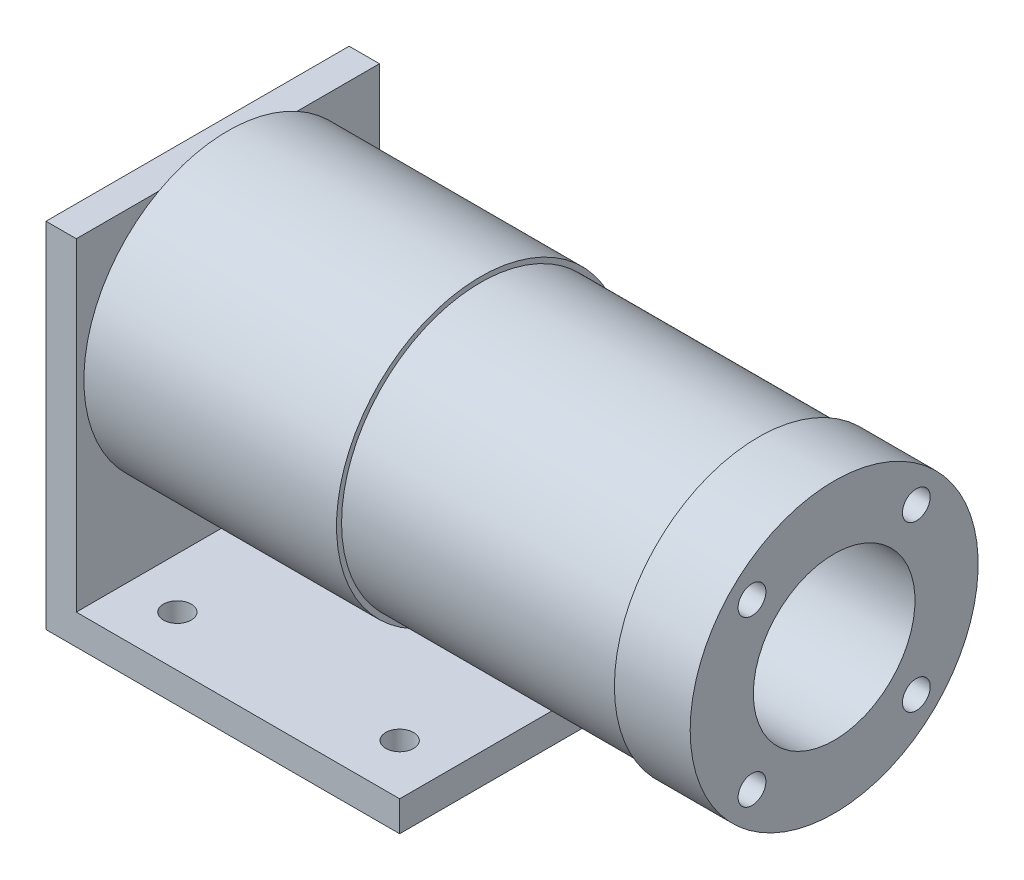
ISO-10303-21;
HEADER;
FILE_DESCRIPTION(('STEP AP214'),'2;1');
FILE_NAME('part.step','',(''),(''),'','','');
FILE_SCHEMA(('AUTOMOTIVE_DESIGN { 1 0 10303 214 1 1 1 1 }'));
ENDSEC;
DATA;
#1=APPLICATION_CONTEXT('core data for automotive mechanical design processes');
#2=APPLICATION_PROTOCOL_DEFINITION('international standard','automotive_design',2000,#1);
#3=PRODUCT_CONTEXT('',#1,'mechanical');
#4=PRODUCT('Part','Part','',(#3));
#5=PRODUCT_RELATED_PRODUCT_CATEGORY('part','',(#4));
#6=PRODUCT_DEFINITION_FORMATION('','',#4);
#7=PRODUCT_DEFINITION_CONTEXT('part definition',#1,'design');
#8=PRODUCT_DEFINITION('design','',#6,#7);
#9=PRODUCT_DEFINITION_SHAPE('','',#8);
#10=(LENGTH_UNIT() NAMED_UNIT(*) SI_UNIT(.MILLI.,.METRE.));
#11=(NAMED_UNIT(*) PLANE_ANGLE_UNIT() SI_UNIT($,.RADIAN.));
#12=(NAMED_UNIT(*) SI_UNIT($,.STERADIAN.) SOLID_ANGLE_UNIT());
#13=UNCERTAINTY_MEASURE_WITH_UNIT(LENGTH_MEASURE(1.E-05),#10,'distance_accuracy_value','');
#14=(GEOMETRIC_REPRESENTATION_CONTEXT(3) GLOBAL_UNCERTAINTY_ASSIGNED_CONTEXT((#13)) GLOBAL_UNIT_ASSIGNED_CONTEXT((#10,
#11,#12)) REPRESENTATION_CONTEXT('',''));
#15=CARTESIAN_POINT('',(0.,0.,0.));
#16=DIRECTION('',(0.,0.,1.));
#17=DIRECTION('',(1.,0.,0.));
#18=AXIS2_PLACEMENT_3D('',#15,#16,#17);
#19=CARTESIAN_POINT('',(126.,16.49,58.51));
#20=DIRECTION('',(1.,0.,0.));
#21=DIRECTION('',(0.,0.,-1.));
#22=AXIS2_PLACEMENT_3D('',#19,#20,#21);
#23=PLANE('',#22);
#24=CARTESIAN_POINT('',(126.,45.,30.));
#25=DIRECTION('',(-1.,0.,0.));
#26=DIRECTION('',(0.,0.,1.));
#27=AXIS2_PLACEMENT_3D('',#24,#25,#26);
#28=CIRCLE('',#27,16.);
#29=CARTESIAN_POINT('',(126.,45.,46.));
#30=VERTEX_POINT('',#29);
#31=EDGE_CURVE('E155',#30,#30,#28,.T.);
#32=ORIENTED_EDGE('',*,*,#31,.T.);
#33=EDGE_LOOP('',(#32));
#34=FACE_BOUND('',#33,.T.);
#35=CARTESIAN_POINT('',(126.,45.,30.));
#36=DIRECTION('',(-1.,0.,0.));
#37=DIRECTION('',(0.,0.,1.));
#38=AXIS2_PLACEMENT_3D('',#35,#36,#37);
#39=CIRCLE('',#38,28.5);
#40=CARTESIAN_POINT('',(126.,45.,58.5));
#41=VERTEX_POINT('',#40);
#42=EDGE_CURVE('E43',#41,#41,#39,.T.);
#43=ORIENTED_EDGE('',*,*,#42,.F.);
#44=EDGE_LOOP('',(#43));
#45=FACE_BOUND('',#44,.T.);
#46=CARTESIAN_POINT('',(126.,28.7365440327094,46.2634559672906));
#47=DIRECTION('',(-1.,0.,0.));
#48=DIRECTION('',(0.,0.,1.));
#49=AXIS2_PLACEMENT_3D('',#46,#47,#48);
#50=CIRCLE('',#49,2.74999999999997);
#51=CARTESIAN_POINT('',(126.,28.7365440327094,49.0134559672906));
#52=VERTEX_POINT('',#51);
#53=EDGE_CURVE('E151',#52,#52,#50,.T.);
#54=ORIENTED_EDGE('',*,*,#53,.T.);
#55=EDGE_LOOP('',(#54));
#56=FACE_BOUND('',#55,.T.);
#57=CARTESIAN_POINT('',(126.,61.2634559672906,13.7365440327094));
#58=DIRECTION('',(-1.,0.,0.));
#59=DIRECTION('',(0.,0.,1.));
#60=AXIS2_PLACEMENT_3D('',#57,#58,#59);
#61=CIRCLE('',#60,2.74999999999997);
#62=CARTESIAN_POINT('',(126.,61.2634559672906,16.4865440327094));
#63=VERTEX_POINT('',#62);
#64=EDGE_CURVE('E154',#63,#63,#61,.T.);
#65=ORIENTED_EDGE('',*,*,#64,.T.);
#66=EDGE_LOOP('',(#65));
#67=FACE_BOUND('',#66,.T.);
#68=CARTESIAN_POINT('',(126.,61.2634559672906,46.2634559672906));
#69=DIRECTION('',(-1.,0.,0.));
#70=DIRECTION('',(0.,0.,1.));
#71=AXIS2_PLACEMENT_3D('',#68,#69,#70);
#72=CIRCLE('',#71,2.74999999999998);
#73=CARTESIAN_POINT('',(126.,61.2634559672906,49.0134559672906));
#74=VERTEX_POINT('',#73);
#75=EDGE_CURVE('E162',#74,#74,#72,.T.);
#76=ORIENTED_EDGE('',*,*,#75,.T.);
#77=EDGE_LOOP('',(#76));
#78=FACE_BOUND('',#77,.T.);
#79=CARTESIAN_POINT('',(126.,28.7365440327094,13.7365440327094));
#80=DIRECTION('',(-1.,0.,0.));
#81=DIRECTION('',(0.,0.,1.));
#82=AXIS2_PLACEMENT_3D('',#79,#80,#81);
#83=CIRCLE('',#82,2.74999999999997);
#84=CARTESIAN_POINT('',(126.,28.7365440327094,16.4865440327094));
#85=VERTEX_POINT('',#84);
#86=EDGE_CURVE('E167',#85,#85,#83,.T.);
#87=ORIENTED_EDGE('',*,*,#86,.T.);
#88=EDGE_LOOP('',(#87));
#89=FACE_BOUND('',#88,.T.);
#90=ADVANCED_FACE('F39',(#34,#45,#56,#67,#78,#89),#23,.T.);
#91=CARTESIAN_POINT('',(0.,0.,0.));
#92=DIRECTION('',(1.,0.,0.));
#93=DIRECTION('',(0.,0.,-1.));
#94=AXIS2_PLACEMENT_3D('',#91,#92,#93);
#95=PLANE('',#94);
#96=CARTESIAN_POINT('',(0.,45.,30.));
#97=DIRECTION('',(1.,0.,0.));
#98=DIRECTION('',(0.,0.,-1.));
#99=AXIS2_PLACEMENT_3D('',#96,#97,#98);
#100=CIRCLE('',#99,16.);
#101=CARTESIAN_POINT('',(0.,45.,14.));
#102=VERTEX_POINT('',#101);
#103=EDGE_CURVE('E171',#102,#102,#100,.T.);
#104=ORIENTED_EDGE('',*,*,#103,.T.);
#105=EDGE_LOOP('',(#104));
#106=FACE_BOUND('',#105,.T.);
#107=CARTESIAN_POINT('',(0.,28.7365440327094,13.7365440327094));
#108=DIRECTION('',(-1.,0.,0.));
#109=DIRECTION('',(0.,0.,1.));
#110=AXIS2_PLACEMENT_3D('',#107,#108,#109);
#111=CIRCLE('',#110,2.74999999999998);
#112=CARTESIAN_POINT('',(0.,28.7365440327094,16.4865440327094));
#113=VERTEX_POINT('',#112);
#114=EDGE_CURVE('E11',#113,#113,#111,.T.);
#115=ORIENTED_EDGE('',*,*,#114,.F.);
#116=EDGE_LOOP('',(#115));
#117=FACE_BOUND('',#116,.T.);
#118=CARTESIAN_POINT('',(0.,61.2634559672906,46.2634559672906));
#119=DIRECTION('',(-1.,0.,0.));
#120=DIRECTION('',(0.,0.,1.));
#121=AXIS2_PLACEMENT_3D('',#118,#119,#120);
#122=CIRCLE('',#121,2.75);
#123=CARTESIAN_POINT('',(0.,61.2634559672906,49.0134559672906));
#124=VERTEX_POINT('',#123);
#125=EDGE_CURVE('E49',#124,#124,#122,.T.);
#126=ORIENTED_EDGE('',*,*,#125,.F.);
#127=EDGE_LOOP('',(#126));
#128=FACE_BOUND('',#127,.T.);
#129=CARTESIAN_POINT('',(0.,28.7365440327094,46.2634559672906));
#130=DIRECTION('',(-1.,0.,0.));
#131=DIRECTION('',(0.,0.,1.));
#132=AXIS2_PLACEMENT_3D('',#129,#130,#131);
#133=CIRCLE('',#132,2.74999999999998);
#134=CARTESIAN_POINT('',(0.,28.7365440327094,49.0134559672906));
#135=VERTEX_POINT('',#134);
#136=EDGE_CURVE('E156',#135,#135,#133,.T.);
#137=ORIENTED_EDGE('',*,*,#136,.F.);
#138=EDGE_LOOP('',(#137));
#139=FACE_BOUND('',#138,.T.);
#140=DIRECTION('',(0.,0.,-1.));
#141=VECTOR('',#140,1.);
#142=CARTESIAN_POINT('',(0.,70.,0.));
#143=LINE('',#142,#141);
#144=CARTESIAN_POINT('',(0.,70.,60.));
#145=VERTEX_POINT('',#144);
#146=CARTESIAN_POINT('',(0.,70.,0.));
#147=VERTEX_POINT('',#146);
#148=EDGE_CURVE('E216',#145,#147,#143,.T.);
#149=ORIENTED_EDGE('',*,*,#148,.T.);
#150=DIRECTION('',(0.,-1.,0.));
#151=VECTOR('',#150,1.);
#152=CARTESIAN_POINT('',(0.,0.,0.));
#153=LINE('',#152,#151);
#154=CARTESIAN_POINT('',(0.,0.,0.));
#155=VERTEX_POINT('',#154);
#156=EDGE_CURVE('E88',#147,#155,#153,.T.);
#157=ORIENTED_EDGE('',*,*,#156,.T.);
#158=DIRECTION('',(0.,0.,1.));
#159=VECTOR('',#158,1.);
#160=CARTESIAN_POINT('',(0.,0.,60.));
#161=LINE('',#160,#159);
#162=CARTESIAN_POINT('',(0.,0.,60.));
#163=VERTEX_POINT('',#162);
#164=EDGE_CURVE('E192',#155,#163,#161,.T.);
#165=ORIENTED_EDGE('',*,*,#164,.T.);
#166=DIRECTION('',(0.,1.,0.));
#167=VECTOR('',#166,1.);
#168=CARTESIAN_POINT('',(0.,70.,60.));
#169=LINE('',#168,#167);
#170=EDGE_CURVE('E187',#163,#145,#169,.T.);
#171=ORIENTED_EDGE('',*,*,#170,.T.);
#172=EDGE_LOOP('',(#149,#157,#165,#171));
#173=FACE_BOUND('',#172,.T.);
#174=CARTESIAN_POINT('',(0.,61.2634559672906,13.7365440327094));
#175=DIRECTION('',(-1.,0.,0.));
#176=DIRECTION('',(0.,0.,1.));
#177=AXIS2_PLACEMENT_3D('',#174,#175,#176);
#178=CIRCLE('',#177,2.74999999999998);
#179=CARTESIAN_POINT('',(0.,61.2634559672906,16.4865440327094));
#180=VERTEX_POINT('',#179);
#181=EDGE_CURVE('E159',#180,#180,#178,.T.);
#182=ORIENTED_EDGE('',*,*,#181,.F.);
#183=EDGE_LOOP('',(#182));
#184=FACE_BOUND('',#183,.T.);
#185=ADVANCED_FACE('F556',(#106,#117,#128,#139,#173,#184),#95,.F.);
#186=CARTESIAN_POINT('',(6.00000000000001,16.49,1.49));
#187=DIRECTION('',(-1.,0.,0.));
#188=DIRECTION('',(0.,0.,1.));
#189=AXIS2_PLACEMENT_3D('',#186,#187,#188);
#190=PLANE('',#189);
#191=CARTESIAN_POINT('',(6.00000000000001,45.,30.));
#192=DIRECTION('',(1.,0.,0.));
#193=DIRECTION('',(0.,0.,-1.));
#194=AXIS2_PLACEMENT_3D('',#191,#192,#193);
#195=CIRCLE('',#194,28.5);
#196=CARTESIAN_POINT('',(6.00000000000001,70.,43.683932183404));
#197=VERTEX_POINT('',#196);
#198=CARTESIAN_POINT('',(6.,70.,16.316067816596));
#199=VERTEX_POINT('',#198);
#200=EDGE_CURVE('E183',#197,#199,#195,.F.);
#201=ORIENTED_EDGE('',*,*,#200,.T.);
#202=DIRECTION('',(0.,0.,-1.));
#203=VECTOR('',#202,1.);
#204=CARTESIAN_POINT('',(6.,70.,0.));
#205=LINE('',#204,#203);
#206=EDGE_CURVE('E212',#197,#199,#205,.T.);
#207=ORIENTED_EDGE('',*,*,#206,.F.);
#208=EDGE_LOOP('',(#201,#207));
#209=FACE_BOUND('',#208,.T.);
#210=ADVANCED_FACE('F560',(#209),#190,.T.);
#211=CARTESIAN_POINT('',(126.,45.,30.));
#212=DIRECTION('',(-1.,0.,0.));
#213=DIRECTION('',(0.,0.,1.));
#214=AXIS2_PLACEMENT_3D('',#211,#212,#213);
#215=CYLINDRICAL_SURFACE('',#214,28.5);
#216=CARTESIAN_POINT('',(111.,45.,30.));
#217=DIRECTION('',(-1.,0.,0.));
#218=DIRECTION('',(0.,0.,1.));
#219=AXIS2_PLACEMENT_3D('',#216,#217,#218);
#220=CIRCLE('',#219,28.5);
#221=CARTESIAN_POINT('',(111.,45.,58.5));
#222=VERTEX_POINT('',#221);
#223=EDGE_CURVE('E174',#222,#222,#220,.T.);
#224=ORIENTED_EDGE('',*,*,#223,.F.);
#225=EDGE_LOOP('',(#224));
#226=FACE_BOUND('',#225,.T.);
#227=ORIENTED_EDGE('',*,*,#42,.T.);
#228=EDGE_LOOP('',(#227));
#229=FACE_BOUND('',#228,.T.);
#230=ADVANCED_FACE('F553',(#226,#229),#215,.T.);
#231=CARTESIAN_POINT('',(111.,16.49,1.49));
#232=DIRECTION('',(-1.,0.,0.));
#233=DIRECTION('',(0.,0.,1.));
#234=AXIS2_PLACEMENT_3D('',#231,#232,#233);
#235=PLANE('',#234);
#236=CARTESIAN_POINT('',(111.,45.,30.));
#237=DIRECTION('',(1.,0.,0.));
#238=DIRECTION('',(0.,0.,-1.));
#239=AXIS2_PLACEMENT_3D('',#236,#237,#238);
#240=CIRCLE('',#239,27.5);
#241=CARTESIAN_POINT('',(111.,45.,2.5));
#242=VERTEX_POINT('',#241);
#243=EDGE_CURVE('E176',#242,#242,#240,.F.);
#244=ORIENTED_EDGE('',*,*,#243,.F.);
#245=EDGE_LOOP('',(#244));
#246=FACE_BOUND('',#245,.T.);
#247=ORIENTED_EDGE('',*,*,#223,.T.);
#248=EDGE_LOOP('',(#247));
#249=FACE_BOUND('',#248,.T.);
#250=ADVANCED_FACE('F605',(#246,#249),#235,.T.);
#251=CARTESIAN_POINT('',(56.,45.,30.));
#252=DIRECTION('',(1.,0.,0.));
#253=DIRECTION('',(0.,0.,-1.));
#254=AXIS2_PLACEMENT_3D('',#251,#252,#253);
#255=CYLINDRICAL_SURFACE('',#254,27.5);
#256=ORIENTED_EDGE('',*,*,#243,.T.);
#257=EDGE_LOOP('',(#256));
#258=FACE_BOUND('',#257,.T.);
#259=CARTESIAN_POINT('',(56.,45.,30.));
#260=DIRECTION('',(1.,0.,0.));
#261=DIRECTION('',(0.,0.,-1.));
#262=AXIS2_PLACEMENT_3D('',#259,#260,#261);
#263=CIRCLE('',#262,27.5);
#264=CARTESIAN_POINT('',(56.,45.,2.5));
#265=VERTEX_POINT('',#264);
#266=EDGE_CURVE('E180',#265,#265,#263,.F.);
#267=ORIENTED_EDGE('',*,*,#266,.F.);
#268=EDGE_LOOP('',(#267));
#269=FACE_BOUND('',#268,.T.);
#270=ADVANCED_FACE('F596',(#258,#269),#255,.T.);
#271=CARTESIAN_POINT('',(56.,16.49,58.51));
#272=DIRECTION('',(1.,0.,0.));
#273=DIRECTION('',(0.,0.,-1.));
#274=AXIS2_PLACEMENT_3D('',#271,#272,#273);
#275=PLANE('',#274);
#276=ORIENTED_EDGE('',*,*,#266,.T.);
#277=EDGE_LOOP('',(#276));
#278=FACE_BOUND('',#277,.T.);
#279=CARTESIAN_POINT('',(56.,45.,30.));
#280=DIRECTION('',(1.,0.,0.));
#281=DIRECTION('',(0.,0.,-1.));
#282=AXIS2_PLACEMENT_3D('',#279,#280,#281);
#283=CIRCLE('',#282,28.5);
#284=CARTESIAN_POINT('',(56.,45.,1.5));
#285=VERTEX_POINT('',#284);
#286=EDGE_CURVE('E196',#285,#285,#283,.F.);
#287=ORIENTED_EDGE('',*,*,#286,.F.);
#288=EDGE_LOOP('',(#287));
#289=FACE_BOUND('',#288,.T.);
#290=ADVANCED_FACE('F587',(#278,#289),#275,.T.);
#291=CARTESIAN_POINT('',(6.00000000000001,45.,30.));
#292=DIRECTION('',(1.,0.,0.));
#293=DIRECTION('',(0.,0.,-1.));
#294=AXIS2_PLACEMENT_3D('',#291,#292,#293);
#295=CYLINDRICAL_SURFACE('',#294,28.5);
#296=ORIENTED_EDGE('',*,*,#286,.T.);
#297=EDGE_LOOP('',(#296));
#298=FACE_BOUND('',#297,.T.);
#299=ORIENTED_EDGE('',*,*,#200,.F.);
#300=CARTESIAN_POINT('',(6.,45.,30.));
#301=DIRECTION('',(1.,0.,0.));
#302=DIRECTION('',(0.,0.,-1.));
#303=AXIS2_PLACEMENT_3D('',#300,#301,#302);
#304=CIRCLE('',#303,28.5);
#305=EDGE_CURVE('E122',#199,#197,#304,.F.);
#306=ORIENTED_EDGE('',*,*,#305,.F.);
#307=EDGE_LOOP('',(#299,#306));
#308=FACE_BOUND('',#307,.T.);
#309=ADVANCED_FACE('F550',(#298,#308),#295,.T.);
#310=CARTESIAN_POINT('',(0.,70.,0.));
#311=DIRECTION('',(0.,-1.,0.));
#312=DIRECTION('',(0.,0.,-1.));
#313=AXIS2_PLACEMENT_3D('',#310,#311,#312);
#314=PLANE('',#313);
#315=CARTESIAN_POINT('',(6.,70.,60.));
#316=VERTEX_POINT('',#315);
#317=EDGE_CURVE('E211',#316,#197,#205,.T.);
#318=ORIENTED_EDGE('',*,*,#317,.T.);
#319=ORIENTED_EDGE('',*,*,#206,.T.);
#320=CARTESIAN_POINT('',(6.,70.,0.));
#321=VERTEX_POINT('',#320);
#322=EDGE_CURVE('E209',#199,#321,#205,.T.);
#323=ORIENTED_EDGE('',*,*,#322,.T.);
#324=DIRECTION('',(1.,0.,0.));
#325=VECTOR('',#324,1.);
#326=CARTESIAN_POINT('',(0.,70.,0.));
#327=LINE('',#326,#325);
#328=EDGE_CURVE('E128',#147,#321,#327,.T.);
#329=ORIENTED_EDGE('',*,*,#328,.F.);
#330=ORIENTED_EDGE('',*,*,#148,.F.);
#331=DIRECTION('',(1.,0.,0.));
#332=VECTOR('',#331,1.);
#333=CARTESIAN_POINT('',(0.,70.,60.));
#334=LINE('',#333,#332);
#335=EDGE_CURVE('E129',#145,#316,#334,.T.);
#336=ORIENTED_EDGE('',*,*,#335,.T.);
#337=EDGE_LOOP('',(#318,#319,#323,#329,#330,#336));
#338=FACE_BOUND('',#337,.T.);
#339=ADVANCED_FACE('F370',(#338),#314,.F.);
#340=CARTESIAN_POINT('',(0.,0.,0.));
#341=DIRECTION('',(0.,0.,1.));
#342=DIRECTION('',(1.,0.,0.));
#343=AXIS2_PLACEMENT_3D('',#340,#341,#342);
#344=PLANE('',#343);
#345=DIRECTION('',(0.,-1.,0.));
#346=VECTOR('',#345,1.);
#347=CARTESIAN_POINT('',(6.,0.,0.));
#348=LINE('',#347,#346);
#349=CARTESIAN_POINT('',(6.,6.,0.));
#350=VERTEX_POINT('',#349);
#351=EDGE_CURVE('E115',#321,#350,#348,.T.);
#352=ORIENTED_EDGE('',*,*,#351,.T.);
#353=DIRECTION('',(1.,0.,0.));
#354=VECTOR('',#353,1.);
#355=CARTESIAN_POINT('',(35.,6.,0.));
#356=LINE('',#355,#354);
#357=CARTESIAN_POINT('',(70.,6.,0.));
#358=VERTEX_POINT('',#357);
#359=EDGE_CURVE('E126',#350,#358,#356,.T.);
#360=ORIENTED_EDGE('',*,*,#359,.T.);
#361=DIRECTION('',(0.,-1.,0.));
#362=VECTOR('',#361,1.);
#363=CARTESIAN_POINT('',(70.,35.,0.));
#364=LINE('',#363,#362);
#365=CARTESIAN_POINT('',(70.,0.,0.));
#366=VERTEX_POINT('',#365);
#367=EDGE_CURVE('E133',#358,#366,#364,.T.);
#368=ORIENTED_EDGE('',*,*,#367,.T.);
#369=DIRECTION('',(1.,0.,0.));
#370=VECTOR('',#369,1.);
#371=CARTESIAN_POINT('',(0.,0.,0.));
#372=LINE('',#371,#370);
#373=EDGE_CURVE('E80',#155,#366,#372,.T.);
#374=ORIENTED_EDGE('',*,*,#373,.F.);
#375=ORIENTED_EDGE('',*,*,#156,.F.);
#376=ORIENTED_EDGE('',*,*,#328,.T.);
#377=EDGE_LOOP('',(#352,#360,#368,#374,#375,#376));
#378=FACE_BOUND('',#377,.T.);
#379=ADVANCED_FACE('F125',(#378),#344,.F.);
#380=CARTESIAN_POINT('',(0.,0.,60.));
#381=DIRECTION('',(0.,1.,0.));
#382=DIRECTION('',(0.,0.,1.));
#383=AXIS2_PLACEMENT_3D('',#380,#381,#382);
#384=PLANE('',#383);
#385=ORIENTED_EDGE('',*,*,#373,.T.);
#386=DIRECTION('',(0.,0.,1.));
#387=VECTOR('',#386,1.);
#388=CARTESIAN_POINT('',(70.,0.,30.));
#389=LINE('',#388,#387);
#390=CARTESIAN_POINT('',(70.,0.,60.));
#391=VERTEX_POINT('',#390);
#392=EDGE_CURVE('E141',#366,#391,#389,.T.);
#393=ORIENTED_EDGE('',*,*,#392,.T.);
#394=DIRECTION('',(1.,0.,0.));
#395=VECTOR('',#394,1.);
#396=CARTESIAN_POINT('',(0.,0.,60.));
#397=LINE('',#396,#395);
#398=EDGE_CURVE('E70',#163,#391,#397,.T.);
#399=ORIENTED_EDGE('',*,*,#398,.F.);
#400=ORIENTED_EDGE('',*,*,#164,.F.);
#401=EDGE_LOOP('',(#385,#393,#399,#400));
#402=FACE_BOUND('',#401,.T.);
#403=CARTESIAN_POINT('',(60.,0.,50.));
#404=DIRECTION('',(0.,-1.,0.));
#405=DIRECTION('',(0.,0.,-1.));
#406=AXIS2_PLACEMENT_3D('',#403,#404,#405);
#407=CIRCLE('',#406,2.75);
#408=CARTESIAN_POINT('',(60.,0.,47.25));
#409=VERTEX_POINT('',#408);
#410=EDGE_CURVE('E144',#409,#409,#407,.F.);
#411=ORIENTED_EDGE('',*,*,#410,.T.);
#412=EDGE_LOOP('',(#411));
#413=FACE_BOUND('',#412,.T.);
#414=CARTESIAN_POINT('',(16.,0.,10.));
#415=DIRECTION('',(0.,-1.,0.));
#416=DIRECTION('',(0.,0.,-1.));
#417=AXIS2_PLACEMENT_3D('',#414,#415,#416);
#418=CIRCLE('',#417,2.75);
#419=CARTESIAN_POINT('',(16.,0.,7.25));
#420=VERTEX_POINT('',#419);
#421=EDGE_CURVE('E240',#420,#420,#418,.F.);
#422=ORIENTED_EDGE('',*,*,#421,.T.);
#423=EDGE_LOOP('',(#422));
#424=FACE_BOUND('',#423,.T.);
#425=CARTESIAN_POINT('',(16.,0.,50.));
#426=DIRECTION('',(0.,-1.,0.));
#427=DIRECTION('',(0.,0.,-1.));
#428=AXIS2_PLACEMENT_3D('',#425,#426,#427);
#429=CIRCLE('',#428,2.75);
#430=CARTESIAN_POINT('',(16.,0.,47.25));
#431=VERTEX_POINT('',#430);
#432=EDGE_CURVE('E236',#431,#431,#429,.F.);
#433=ORIENTED_EDGE('',*,*,#432,.T.);
#434=EDGE_LOOP('',(#433));
#435=FACE_BOUND('',#434,.T.);
#436=CARTESIAN_POINT('',(60.,0.,10.));
#437=DIRECTION('',(0.,-1.,0.));
#438=DIRECTION('',(0.,0.,-1.));
#439=AXIS2_PLACEMENT_3D('',#436,#437,#438);
#440=CIRCLE('',#439,2.75);
#441=CARTESIAN_POINT('',(60.,0.,7.25));
#442=VERTEX_POINT('',#441);
#443=EDGE_CURVE('E206',#442,#442,#440,.F.);
#444=ORIENTED_EDGE('',*,*,#443,.T.);
#445=EDGE_LOOP('',(#444));
#446=FACE_BOUND('',#445,.T.);
#447=ADVANCED_FACE('F369',(#402,#413,#424,#435,#446),#384,.F.);
#448=CARTESIAN_POINT('',(0.,70.,60.));
#449=DIRECTION('',(0.,0.,-1.));
#450=DIRECTION('',(-1.,0.,0.));
#451=AXIS2_PLACEMENT_3D('',#448,#449,#450);
#452=PLANE('',#451);
#453=ORIENTED_EDGE('',*,*,#398,.T.);
#454=DIRECTION('',(0.,1.,0.));
#455=VECTOR('',#454,1.);
#456=CARTESIAN_POINT('',(70.,35.,60.));
#457=LINE('',#456,#455);
#458=CARTESIAN_POINT('',(70.,6.,60.));
#459=VERTEX_POINT('',#458);
#460=EDGE_CURVE('E145',#391,#459,#457,.T.);
#461=ORIENTED_EDGE('',*,*,#460,.T.);
#462=DIRECTION('',(-1.,0.,0.));
#463=VECTOR('',#462,1.);
#464=CARTESIAN_POINT('',(35.,6.,60.));
#465=LINE('',#464,#463);
#466=CARTESIAN_POINT('',(6.,6.,60.));
#467=VERTEX_POINT('',#466);
#468=EDGE_CURVE('E148',#459,#467,#465,.T.);
#469=ORIENTED_EDGE('',*,*,#468,.T.);
#470=DIRECTION('',(0.,1.,0.));
#471=VECTOR('',#470,1.);
#472=CARTESIAN_POINT('',(6.,70.,60.));
#473=LINE('',#472,#471);
#474=EDGE_CURVE('E117',#467,#316,#473,.T.);
#475=ORIENTED_EDGE('',*,*,#474,.T.);
#476=ORIENTED_EDGE('',*,*,#335,.F.);
#477=ORIENTED_EDGE('',*,*,#170,.F.);
#478=EDGE_LOOP('',(#453,#461,#469,#475,#476,#477));
#479=FACE_BOUND('',#478,.T.);
#480=ADVANCED_FACE('F396',(#479),#452,.F.);
#481=CARTESIAN_POINT('',(6.,0.,0.));
#482=DIRECTION('',(1.,0.,0.));
#483=DIRECTION('',(0.,0.,-1.));
#484=AXIS2_PLACEMENT_3D('',#481,#482,#483);
#485=PLANE('',#484);
#486=DIRECTION('',(0.,0.,-1.));
#487=VECTOR('',#486,1.);
#488=CARTESIAN_POINT('',(6.,6.,30.));
#489=LINE('',#488,#487);
#490=EDGE_CURVE('E112',#467,#350,#489,.T.);
#491=ORIENTED_EDGE('',*,*,#490,.T.);
#492=ORIENTED_EDGE('',*,*,#351,.F.);
#493=ORIENTED_EDGE('',*,*,#322,.F.);
#494=ORIENTED_EDGE('',*,*,#305,.T.);
#495=ORIENTED_EDGE('',*,*,#317,.F.);
#496=ORIENTED_EDGE('',*,*,#474,.F.);
#497=EDGE_LOOP('',(#491,#492,#493,#494,#495,#496));
#498=FACE_BOUND('',#497,.T.);
#499=ADVANCED_FACE('F114',(#498),#485,.T.);
#500=CARTESIAN_POINT('',(60.,6.,10.));
#501=DIRECTION('',(0.,-1.,0.));
#502=DIRECTION('',(0.,0.,-1.));
#503=AXIS2_PLACEMENT_3D('',#500,#501,#502);
#504=CYLINDRICAL_SURFACE('',#503,2.75);
#505=ORIENTED_EDGE('',*,*,#443,.F.);
#506=EDGE_LOOP('',(#505));
#507=FACE_BOUND('',#506,.T.);
#508=CARTESIAN_POINT('',(60.,6.,10.));
#509=DIRECTION('',(0.,-1.,0.));
#510=DIRECTION('',(0.,0.,-1.));
#511=AXIS2_PLACEMENT_3D('',#508,#509,#510);
#512=CIRCLE('',#511,2.75);
#513=CARTESIAN_POINT('',(60.,6.,7.25));
#514=VERTEX_POINT('',#513);
#515=EDGE_CURVE('E218',#514,#514,#512,.T.);
#516=ORIENTED_EDGE('',*,*,#515,.F.);
#517=EDGE_LOOP('',(#516));
#518=FACE_BOUND('',#517,.T.);
#519=ADVANCED_FACE('F426',(#507,#518),#504,.F.);
#520=CARTESIAN_POINT('',(16.,6.,50.));
#521=DIRECTION('',(0.,-1.,0.));
#522=DIRECTION('',(0.,0.,-1.));
#523=AXIS2_PLACEMENT_3D('',#520,#521,#522);
#524=CYLINDRICAL_SURFACE('',#523,2.75);
#525=ORIENTED_EDGE('',*,*,#432,.F.);
#526=EDGE_LOOP('',(#525));
#527=FACE_BOUND('',#526,.T.);
#528=CARTESIAN_POINT('',(16.,6.,50.));
#529=DIRECTION('',(0.,-1.,0.));
#530=DIRECTION('',(0.,0.,-1.));
#531=AXIS2_PLACEMENT_3D('',#528,#529,#530);
#532=CIRCLE('',#531,2.75);
#533=CARTESIAN_POINT('',(16.,6.,47.25));
#534=VERTEX_POINT('',#533);
#535=EDGE_CURVE('E222',#534,#534,#532,.T.);
#536=ORIENTED_EDGE('',*,*,#535,.F.);
#537=EDGE_LOOP('',(#536));
#538=FACE_BOUND('',#537,.T.);
#539=ADVANCED_FACE('F434',(#527,#538),#524,.F.);
#540=CARTESIAN_POINT('',(16.,6.,10.));
#541=DIRECTION('',(0.,-1.,0.));
#542=DIRECTION('',(0.,0.,-1.));
#543=AXIS2_PLACEMENT_3D('',#540,#541,#542);
#544=CYLINDRICAL_SURFACE('',#543,2.75);
#545=ORIENTED_EDGE('',*,*,#421,.F.);
#546=EDGE_LOOP('',(#545));
#547=FACE_BOUND('',#546,.T.);
#548=CARTESIAN_POINT('',(16.,6.,10.));
#549=DIRECTION('',(0.,-1.,0.));
#550=DIRECTION('',(0.,0.,-1.));
#551=AXIS2_PLACEMENT_3D('',#548,#549,#550);
#552=CIRCLE('',#551,2.75);
#553=CARTESIAN_POINT('',(16.,6.,7.25));
#554=VERTEX_POINT('',#553);
#555=EDGE_CURVE('E226',#554,#554,#552,.T.);
#556=ORIENTED_EDGE('',*,*,#555,.F.);
#557=EDGE_LOOP('',(#556));
#558=FACE_BOUND('',#557,.T.);
#559=ADVANCED_FACE('F446',(#547,#558),#544,.F.);
#560=CARTESIAN_POINT('',(60.,6.,50.));
#561=DIRECTION('',(0.,-1.,0.));
#562=DIRECTION('',(0.,0.,-1.));
#563=AXIS2_PLACEMENT_3D('',#560,#561,#562);
#564=CYLINDRICAL_SURFACE('',#563,2.75);
#565=ORIENTED_EDGE('',*,*,#410,.F.);
#566=EDGE_LOOP('',(#565));
#567=FACE_BOUND('',#566,.T.);
#568=CARTESIAN_POINT('',(60.,6.,50.));
#569=DIRECTION('',(0.,-1.,0.));
#570=DIRECTION('',(0.,0.,-1.));
#571=AXIS2_PLACEMENT_3D('',#568,#569,#570);
#572=CIRCLE('',#571,2.75);
#573=CARTESIAN_POINT('',(60.,6.,47.25));
#574=VERTEX_POINT('',#573);
#575=EDGE_CURVE('E200',#574,#574,#572,.T.);
#576=ORIENTED_EDGE('',*,*,#575,.F.);
#577=EDGE_LOOP('',(#576));
#578=FACE_BOUND('',#577,.T.);
#579=ADVANCED_FACE('F458',(#567,#578),#564,.F.);
#580=CARTESIAN_POINT('',(70.,-0.01,-0.01));
#581=DIRECTION('',(1.,0.,0.));
#582=DIRECTION('',(0.,1.,0.));
#583=AXIS2_PLACEMENT_3D('',#580,#581,#582);
#584=PLANE('',#583);
#585=ORIENTED_EDGE('',*,*,#460,.F.);
#586=ORIENTED_EDGE('',*,*,#392,.F.);
#587=ORIENTED_EDGE('',*,*,#367,.F.);
#588=DIRECTION('',(0.,0.,-1.));
#589=VECTOR('',#588,1.);
#590=CARTESIAN_POINT('',(70.,6.,30.));
#591=LINE('',#590,#589);
#592=EDGE_CURVE('E58',#459,#358,#591,.T.);
#593=ORIENTED_EDGE('',*,*,#592,.F.);
#594=EDGE_LOOP('',(#585,#586,#587,#593));
#595=FACE_BOUND('',#594,.T.);
#596=ADVANCED_FACE('F470',(#595),#584,.T.);
#597=CARTESIAN_POINT('',(70.01,6.,-0.01));
#598=DIRECTION('',(0.,1.,0.));
#599=DIRECTION('',(-1.,0.,0.));
#600=AXIS2_PLACEMENT_3D('',#597,#598,#599);
#601=PLANE('',#600);
#602=ORIENTED_EDGE('',*,*,#575,.T.);
#603=EDGE_LOOP('',(#602));
#604=FACE_BOUND('',#603,.T.);
#605=ORIENTED_EDGE('',*,*,#555,.T.);
#606=EDGE_LOOP('',(#605));
#607=FACE_BOUND('',#606,.T.);
#608=ORIENTED_EDGE('',*,*,#535,.T.);
#609=EDGE_LOOP('',(#608));
#610=FACE_BOUND('',#609,.T.);
#611=ORIENTED_EDGE('',*,*,#515,.T.);
#612=EDGE_LOOP('',(#611));
#613=FACE_BOUND('',#612,.T.);
#614=ORIENTED_EDGE('',*,*,#468,.F.);
#615=ORIENTED_EDGE('',*,*,#592,.T.);
#616=ORIENTED_EDGE('',*,*,#359,.F.);
#617=ORIENTED_EDGE('',*,*,#490,.F.);
#618=EDGE_LOOP('',(#614,#615,#616,#617));
#619=FACE_BOUND('',#618,.T.);
#620=ADVANCED_FACE('F131',(#604,#607,#610,#613,#619),#601,.T.);
#621=CARTESIAN_POINT('',(0.,28.7365440327094,46.2634559672906));
#622=DIRECTION('',(-1.,0.,0.));
#623=DIRECTION('',(0.,0.,1.));
#624=AXIS2_PLACEMENT_3D('',#621,#622,#623);
#625=CYLINDRICAL_SURFACE('',#624,2.74999999999998);
#626=ORIENTED_EDGE('',*,*,#53,.F.);
#627=EDGE_LOOP('',(#626));
#628=FACE_BOUND('',#627,.T.);
#629=ORIENTED_EDGE('',*,*,#136,.T.);
#630=EDGE_LOOP('',(#629));
#631=FACE_BOUND('',#630,.T.);
#632=ADVANCED_FACE('F437',(#628,#631),#625,.F.);
#633=CARTESIAN_POINT('',(0.,61.2634559672906,13.7365440327094));
#634=DIRECTION('',(-1.,0.,0.));
#635=DIRECTION('',(0.,0.,1.));
#636=AXIS2_PLACEMENT_3D('',#633,#634,#635);
#637=CYLINDRICAL_SURFACE('',#636,2.74999999999997);
#638=ORIENTED_EDGE('',*,*,#64,.F.);
#639=EDGE_LOOP('',(#638));
#640=FACE_BOUND('',#639,.T.);
#641=ORIENTED_EDGE('',*,*,#181,.T.);
#642=EDGE_LOOP('',(#641));
#643=FACE_BOUND('',#642,.T.);
#644=ADVANCED_FACE('F503',(#640,#643),#637,.F.);
#645=CARTESIAN_POINT('',(0.,61.2634559672906,46.2634559672906));
#646=DIRECTION('',(-1.,0.,0.));
#647=DIRECTION('',(0.,0.,1.));
#648=AXIS2_PLACEMENT_3D('',#645,#646,#647);
#649=CYLINDRICAL_SURFACE('',#648,2.74999999999999);
#650=ORIENTED_EDGE('',*,*,#75,.F.);
#651=EDGE_LOOP('',(#650));
#652=FACE_BOUND('',#651,.T.);
#653=ORIENTED_EDGE('',*,*,#125,.T.);
#654=EDGE_LOOP('',(#653));
#655=FACE_BOUND('',#654,.T.);
#656=ADVANCED_FACE('F512',(#652,#655),#649,.F.);
#657=CARTESIAN_POINT('',(0.,28.7365440327094,13.7365440327094));
#658=DIRECTION('',(-1.,0.,0.));
#659=DIRECTION('',(0.,0.,1.));
#660=AXIS2_PLACEMENT_3D('',#657,#658,#659);
#661=CYLINDRICAL_SURFACE('',#660,2.74999999999998);
#662=ORIENTED_EDGE('',*,*,#86,.F.);
#663=EDGE_LOOP('',(#662));
#664=FACE_BOUND('',#663,.T.);
#665=ORIENTED_EDGE('',*,*,#114,.T.);
#666=EDGE_LOOP('',(#665));
#667=FACE_BOUND('',#666,.T.);
#668=ADVANCED_FACE('F521',(#664,#667),#661,.F.);
#669=CARTESIAN_POINT('',(-1.,45.,30.));
#670=DIRECTION('',(-1.,0.,0.));
#671=DIRECTION('',(0.,0.,1.));
#672=AXIS2_PLACEMENT_3D('',#669,#670,#671);
#673=CYLINDRICAL_SURFACE('',#672,16.);
#674=ORIENTED_EDGE('',*,*,#31,.F.);
#675=EDGE_LOOP('',(#674));
#676=FACE_BOUND('',#675,.T.);
#677=ORIENTED_EDGE('',*,*,#103,.F.);
#678=EDGE_LOOP('',(#677));
#679=FACE_BOUND('',#678,.T.);
#680=ADVANCED_FACE('F41',(#676,#679),#673,.F.);
#681=CLOSED_SHELL('',(#90,#185,#210,#230,#250,#270,#290,#309,#339,#379,#447,#480,#499,#519,#539,
#559,#579,#596,#620,#632,#644,#656,#668,#680));
#682=MANIFOLD_SOLID_BREP('B2',#681);
#683=ADVANCED_BREP_SHAPE_REPRESENTATION('',(#18,#682),#14);
#684=SHAPE_DEFINITION_REPRESENTATION(#9,#683);
ENDSEC;
END-ISO-10303-21;
